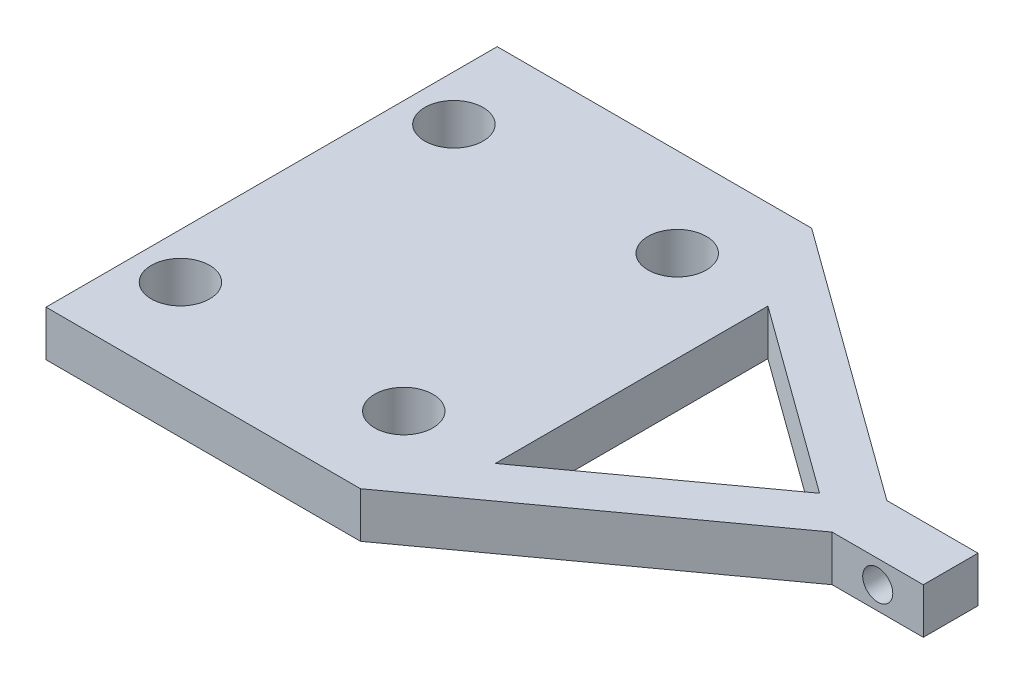
ISO-10303-21;
HEADER;
FILE_DESCRIPTION(('STEP AP214'),'2;1');
FILE_NAME('part.step','',(''),(''),'','','');
FILE_SCHEMA(('AUTOMOTIVE_DESIGN { 1 0 10303 214 1 1 1 1 }'));
ENDSEC;
DATA;
#1=APPLICATION_CONTEXT('core data for automotive mechanical design processes');
#2=APPLICATION_PROTOCOL_DEFINITION('international standard','automotive_design',2000,#1);
#3=PRODUCT_CONTEXT('',#1,'mechanical');
#4=PRODUCT('Part','Part','',(#3));
#5=PRODUCT_RELATED_PRODUCT_CATEGORY('part','',(#4));
#6=PRODUCT_DEFINITION_FORMATION('','',#4);
#7=PRODUCT_DEFINITION_CONTEXT('part definition',#1,'design');
#8=PRODUCT_DEFINITION('design','',#6,#7);
#9=PRODUCT_DEFINITION_SHAPE('','',#8);
#10=(LENGTH_UNIT() NAMED_UNIT(*) SI_UNIT(.MILLI.,.METRE.));
#11=(NAMED_UNIT(*) PLANE_ANGLE_UNIT() SI_UNIT($,.RADIAN.));
#12=(NAMED_UNIT(*) SI_UNIT($,.STERADIAN.) SOLID_ANGLE_UNIT());
#13=UNCERTAINTY_MEASURE_WITH_UNIT(LENGTH_MEASURE(1.E-05),#10,'distance_accuracy_value','');
#14=(GEOMETRIC_REPRESENTATION_CONTEXT(3) GLOBAL_UNCERTAINTY_ASSIGNED_CONTEXT((#13)) GLOBAL_UNIT_ASSIGNED_CONTEXT((#10,
#11,#12)) REPRESENTATION_CONTEXT('',''));
#15=CARTESIAN_POINT('',(0.,0.,0.));
#16=DIRECTION('',(0.,0.,1.));
#17=DIRECTION('',(1.,0.,0.));
#18=AXIS2_PLACEMENT_3D('',#15,#16,#17);
#19=CARTESIAN_POINT('',(0.,5.,0.));
#20=DIRECTION('',(1.,0.,0.));
#21=DIRECTION('',(0.,0.,-1.));
#22=AXIS2_PLACEMENT_3D('',#19,#20,#21);
#23=PLANE('',#22);
#24=DIRECTION('',(0.,0.,1.));
#25=VECTOR('',#24,1.);
#26=CARTESIAN_POINT('',(0.,0.,0.));
#27=LINE('',#26,#25);
#28=CARTESIAN_POINT('',(0.,0.,-49.5));
#29=VERTEX_POINT('',#28);
#30=CARTESIAN_POINT('',(0.,0.,0.));
#31=VERTEX_POINT('',#30);
#32=EDGE_CURVE('E355',#29,#31,#27,.T.);
#33=ORIENTED_EDGE('',*,*,#32,.T.);
#34=DIRECTION('',(0.,-1.,0.));
#35=VECTOR('',#34,1.);
#36=CARTESIAN_POINT('',(0.,5.,0.));
#37=LINE('',#36,#35);
#38=CARTESIAN_POINT('',(0.,5.,0.));
#39=VERTEX_POINT('',#38);
#40=EDGE_CURVE('E13',#39,#31,#37,.T.);
#41=ORIENTED_EDGE('',*,*,#40,.F.);
#42=DIRECTION('',(0.,0.,1.));
#43=VECTOR('',#42,1.);
#44=CARTESIAN_POINT('',(0.,5.,0.));
#45=LINE('',#44,#43);
#46=CARTESIAN_POINT('',(0.,5.,-49.5));
#47=VERTEX_POINT('',#46);
#48=EDGE_CURVE('E249',#47,#39,#45,.T.);
#49=ORIENTED_EDGE('',*,*,#48,.F.);
#50=DIRECTION('',(0.,-1.,0.));
#51=VECTOR('',#50,1.);
#52=CARTESIAN_POINT('',(0.,5.,-49.5));
#53=LINE('',#52,#51);
#54=EDGE_CURVE('E343',#47,#29,#53,.T.);
#55=ORIENTED_EDGE('',*,*,#54,.T.);
#56=EDGE_LOOP('',(#33,#41,#49,#55));
#57=FACE_BOUND('',#56,.T.);
#58=ADVANCED_FACE('F73',(#57),#23,.F.);
#59=CARTESIAN_POINT('',(0.,5.,0.));
#60=DIRECTION('',(0.,0.,-1.));
#61=DIRECTION('',(-1.,0.,0.));
#62=AXIS2_PLACEMENT_3D('',#59,#60,#61);
#63=PLANE('',#62);
#64=DIRECTION('',(1.,0.,0.));
#65=VECTOR('',#64,1.);
#66=CARTESIAN_POINT('',(0.,0.,0.));
#67=LINE('',#66,#65);
#68=CARTESIAN_POINT('',(34.5,0.,0.));
#69=VERTEX_POINT('',#68);
#70=EDGE_CURVE('E102',#31,#69,#67,.T.);
#71=ORIENTED_EDGE('',*,*,#70,.T.);
#72=DIRECTION('',(0.,-1.,0.));
#73=VECTOR('',#72,1.);
#74=CARTESIAN_POINT('',(34.5,5.,0.));
#75=LINE('',#74,#73);
#76=CARTESIAN_POINT('',(34.5,5.,0.));
#77=VERTEX_POINT('',#76);
#78=EDGE_CURVE('E82',#77,#69,#75,.T.);
#79=ORIENTED_EDGE('',*,*,#78,.F.);
#80=DIRECTION('',(1.,0.,0.));
#81=VECTOR('',#80,1.);
#82=CARTESIAN_POINT('',(0.,5.,0.));
#83=LINE('',#82,#81);
#84=EDGE_CURVE('E253',#39,#77,#83,.T.);
#85=ORIENTED_EDGE('',*,*,#84,.F.);
#86=ORIENTED_EDGE('',*,*,#40,.T.);
#87=EDGE_LOOP('',(#71,#79,#85,#86));
#88=FACE_BOUND('',#87,.T.);
#89=ADVANCED_FACE('F365',(#88),#63,.F.);
#90=CARTESIAN_POINT('',(0.,5.,-49.5));
#91=DIRECTION('',(0.,0.,1.));
#92=DIRECTION('',(1.,0.,0.));
#93=AXIS2_PLACEMENT_3D('',#90,#91,#92);
#94=PLANE('',#93);
#95=DIRECTION('',(-1.,0.,0.));
#96=VECTOR('',#95,1.);
#97=CARTESIAN_POINT('',(0.,0.,-49.5));
#98=LINE('',#97,#96);
#99=CARTESIAN_POINT('',(34.5,0.,-49.5));
#100=VERTEX_POINT('',#99);
#101=EDGE_CURVE('E107',#100,#29,#98,.T.);
#102=ORIENTED_EDGE('',*,*,#101,.T.);
#103=ORIENTED_EDGE('',*,*,#54,.F.);
#104=DIRECTION('',(-1.,0.,0.));
#105=VECTOR('',#104,1.);
#106=CARTESIAN_POINT('',(0.,5.,-49.5));
#107=LINE('',#106,#105);
#108=CARTESIAN_POINT('',(34.5,5.,-49.5));
#109=VERTEX_POINT('',#108);
#110=EDGE_CURVE('E90',#109,#47,#107,.T.);
#111=ORIENTED_EDGE('',*,*,#110,.F.);
#112=DIRECTION('',(0.,-1.,0.));
#113=VECTOR('',#112,1.);
#114=CARTESIAN_POINT('',(34.5,5.,-49.5));
#115=LINE('',#114,#113);
#116=EDGE_CURVE('E340',#109,#100,#115,.T.);
#117=ORIENTED_EDGE('',*,*,#116,.T.);
#118=EDGE_LOOP('',(#102,#103,#111,#117));
#119=FACE_BOUND('',#118,.T.);
#120=ADVANCED_FACE('F283',(#119),#94,.F.);
#121=CARTESIAN_POINT('',(0.,5.,0.));
#122=DIRECTION('',(0.,-1.,0.));
#123=DIRECTION('',(0.,0.,-1.));
#124=AXIS2_PLACEMENT_3D('',#121,#122,#123);
#125=PLANE('',#124);
#126=ORIENTED_EDGE('',*,*,#84,.T.);
#127=DIRECTION('',(0.809610443394388,0.,-0.586967571460931));
#128=VECTOR('',#127,1.);
#129=CARTESIAN_POINT('',(34.5,5.,0.));
#130=LINE('',#129,#128);
#131=CARTESIAN_POINT('',(64.5,5.,-21.75));
#132=VERTEX_POINT('',#131);
#133=EDGE_CURVE('E203',#77,#132,#130,.T.);
#134=ORIENTED_EDGE('',*,*,#133,.T.);
#135=DIRECTION('',(-1.,0.,0.));
#136=VECTOR('',#135,1.);
#137=CARTESIAN_POINT('',(74.5,5.,-21.75));
#138=LINE('',#137,#136);
#139=CARTESIAN_POINT('',(74.5,5.,-21.75));
#140=VERTEX_POINT('',#139);
#141=EDGE_CURVE('E210',#140,#132,#138,.T.);
#142=ORIENTED_EDGE('',*,*,#141,.F.);
#143=DIRECTION('',(0.,0.,1.));
#144=VECTOR('',#143,1.);
#145=CARTESIAN_POINT('',(74.5,5.,-27.75));
#146=LINE('',#145,#144);
#147=CARTESIAN_POINT('',(74.5,5.,-27.75));
#148=VERTEX_POINT('',#147);
#149=EDGE_CURVE('E215',#148,#140,#146,.T.);
#150=ORIENTED_EDGE('',*,*,#149,.F.);
#151=DIRECTION('',(-1.,0.,0.));
#152=VECTOR('',#151,1.);
#153=CARTESIAN_POINT('',(74.5,5.,-27.75));
#154=LINE('',#153,#152);
#155=CARTESIAN_POINT('',(64.5,5.,-27.75));
#156=VERTEX_POINT('',#155);
#157=EDGE_CURVE('E300',#148,#156,#154,.T.);
#158=ORIENTED_EDGE('',*,*,#157,.T.);
#159=DIRECTION('',(-0.809610443394388,0.,-0.586967571460931));
#160=VECTOR('',#159,1.);
#161=CARTESIAN_POINT('',(64.5,5.,-27.75));
#162=LINE('',#161,#160);
#163=EDGE_CURVE('E308',#156,#109,#162,.T.);
#164=ORIENTED_EDGE('',*,*,#163,.T.);
#165=ORIENTED_EDGE('',*,*,#110,.T.);
#166=ORIENTED_EDGE('',*,*,#48,.T.);
#167=EDGE_LOOP('',(#126,#134,#142,#150,#158,#164,#165,#166));
#168=FACE_BOUND('',#167,.T.);
#169=CARTESIAN_POINT('',(29.5,5.,-39.75));
#170=DIRECTION('',(0.,1.,0.));
#171=DIRECTION('',(0.,0.,-1.));
#172=AXIS2_PLACEMENT_3D('',#169,#170,#171);
#173=CIRCLE('',#172,3.2);
#174=CARTESIAN_POINT('',(29.5,5.,-42.95));
#175=VERTEX_POINT('',#174);
#176=EDGE_CURVE('E260',#175,#175,#173,.T.);
#177=ORIENTED_EDGE('',*,*,#176,.F.);
#178=EDGE_LOOP('',(#177));
#179=FACE_BOUND('',#178,.T.);
#180=CARTESIAN_POINT('',(29.5,5.,-9.75));
#181=DIRECTION('',(0.,1.,0.));
#182=DIRECTION('',(0.,0.,1.));
#183=AXIS2_PLACEMENT_3D('',#180,#181,#182);
#184=CIRCLE('',#183,3.2);
#185=CARTESIAN_POINT('',(29.5,5.,-6.55));
#186=VERTEX_POINT('',#185);
#187=EDGE_CURVE('E288',#186,#186,#184,.T.);
#188=ORIENTED_EDGE('',*,*,#187,.F.);
#189=EDGE_LOOP('',(#188));
#190=FACE_BOUND('',#189,.T.);
#191=CARTESIAN_POINT('',(5.,5.,-9.75));
#192=DIRECTION('',(0.,1.,0.));
#193=DIRECTION('',(0.,0.,-1.));
#194=AXIS2_PLACEMENT_3D('',#191,#192,#193);
#195=CIRCLE('',#194,3.2);
#196=CARTESIAN_POINT('',(5.,5.,-12.95));
#197=VERTEX_POINT('',#196);
#198=EDGE_CURVE('E228',#197,#197,#195,.T.);
#199=ORIENTED_EDGE('',*,*,#198,.F.);
#200=EDGE_LOOP('',(#199));
#201=FACE_BOUND('',#200,.T.);
#202=CARTESIAN_POINT('',(5.,5.,-39.75));
#203=DIRECTION('',(0.,1.,0.));
#204=DIRECTION('',(0.,0.,1.));
#205=AXIS2_PLACEMENT_3D('',#202,#203,#204);
#206=CIRCLE('',#205,3.2);
#207=CARTESIAN_POINT('',(5.,5.,-36.55));
#208=VERTEX_POINT('',#207);
#209=EDGE_CURVE('E233',#208,#208,#206,.T.);
#210=ORIENTED_EDGE('',*,*,#209,.F.);
#211=EDGE_LOOP('',(#210));
#212=FACE_BOUND('',#211,.T.);
#213=DIRECTION('',(0.809610443394387,0.,-0.586967571460931));
#214=VECTOR('',#213,1.);
#215=CARTESIAN_POINT('',(39.5,5.,-9.8008096635178));
#216=LINE('',#215,#214);
#217=CARTESIAN_POINT('',(39.5,5.,-9.8008096635178));
#218=VERTEX_POINT('',#217);
#219=CARTESIAN_POINT('',(60.1195728779065,5.,-24.75));
#220=VERTEX_POINT('',#219);
#221=EDGE_CURVE('E165',#218,#220,#216,.T.);
#222=ORIENTED_EDGE('',*,*,#221,.F.);
#223=DIRECTION('',(0.,0.,1.));
#224=VECTOR('',#223,1.);
#225=CARTESIAN_POINT('',(39.5,5.,-39.6991903364822));
#226=LINE('',#225,#224);
#227=CARTESIAN_POINT('',(39.5,5.,-39.6991903364822));
#228=VERTEX_POINT('',#227);
#229=EDGE_CURVE('E171',#228,#218,#226,.T.);
#230=ORIENTED_EDGE('',*,*,#229,.F.);
#231=DIRECTION('',(-0.809610443394388,0.,-0.586967571460931));
#232=VECTOR('',#231,1.);
#233=CARTESIAN_POINT('',(60.1195728779065,5.,-24.75));
#234=LINE('',#233,#232);
#235=EDGE_CURVE('E170',#220,#228,#234,.T.);
#236=ORIENTED_EDGE('',*,*,#235,.F.);
#237=EDGE_LOOP('',(#222,#230,#236));
#238=FACE_BOUND('',#237,.T.);
#239=ADVANCED_FACE('F280',(#168,#179,#190,#201,#212,#238),#125,.F.);
#240=CARTESIAN_POINT('',(0.,0.,0.));
#241=DIRECTION('',(0.,-1.,0.));
#242=DIRECTION('',(0.,0.,-1.));
#243=AXIS2_PLACEMENT_3D('',#240,#241,#242);
#244=PLANE('',#243);
#245=ORIENTED_EDGE('',*,*,#101,.F.);
#246=DIRECTION('',(-0.809610443394388,0.,-0.586967571460931));
#247=VECTOR('',#246,1.);
#248=CARTESIAN_POINT('',(64.5,0.,-27.75));
#249=LINE('',#248,#247);
#250=CARTESIAN_POINT('',(64.5,0.,-27.75));
#251=VERTEX_POINT('',#250);
#252=EDGE_CURVE('E191',#251,#100,#249,.T.);
#253=ORIENTED_EDGE('',*,*,#252,.F.);
#254=DIRECTION('',(-1.,0.,0.));
#255=VECTOR('',#254,1.);
#256=CARTESIAN_POINT('',(74.5,0.,-27.75));
#257=LINE('',#256,#255);
#258=CARTESIAN_POINT('',(74.5,0.,-27.75));
#259=VERTEX_POINT('',#258);
#260=EDGE_CURVE('E194',#259,#251,#257,.T.);
#261=ORIENTED_EDGE('',*,*,#260,.F.);
#262=DIRECTION('',(0.,0.,1.));
#263=VECTOR('',#262,1.);
#264=CARTESIAN_POINT('',(74.5,0.,-27.75));
#265=LINE('',#264,#263);
#266=CARTESIAN_POINT('',(74.5,0.,-21.75));
#267=VERTEX_POINT('',#266);
#268=EDGE_CURVE('E200',#259,#267,#265,.T.);
#269=ORIENTED_EDGE('',*,*,#268,.T.);
#270=DIRECTION('',(-1.,0.,0.));
#271=VECTOR('',#270,1.);
#272=CARTESIAN_POINT('',(74.5,0.,-21.75));
#273=LINE('',#272,#271);
#274=CARTESIAN_POINT('',(64.5,0.,-21.75));
#275=VERTEX_POINT('',#274);
#276=EDGE_CURVE('E188',#267,#275,#273,.T.);
#277=ORIENTED_EDGE('',*,*,#276,.T.);
#278=DIRECTION('',(0.809610443394388,0.,-0.586967571460931));
#279=VECTOR('',#278,1.);
#280=CARTESIAN_POINT('',(34.5,0.,0.));
#281=LINE('',#280,#279);
#282=EDGE_CURVE('E206',#69,#275,#281,.T.);
#283=ORIENTED_EDGE('',*,*,#282,.F.);
#284=ORIENTED_EDGE('',*,*,#70,.F.);
#285=ORIENTED_EDGE('',*,*,#32,.F.);
#286=EDGE_LOOP('',(#245,#253,#261,#269,#277,#283,#284,#285));
#287=FACE_BOUND('',#286,.T.);
#288=CARTESIAN_POINT('',(29.5,0.,-39.75));
#289=DIRECTION('',(0.,1.,0.));
#290=DIRECTION('',(0.,0.,-1.));
#291=AXIS2_PLACEMENT_3D('',#288,#289,#290);
#292=CIRCLE('',#291,3.2);
#293=CARTESIAN_POINT('',(29.5,0.,-42.95));
#294=VERTEX_POINT('',#293);
#295=EDGE_CURVE('E181',#294,#294,#292,.T.);
#296=ORIENTED_EDGE('',*,*,#295,.T.);
#297=EDGE_LOOP('',(#296));
#298=FACE_BOUND('',#297,.T.);
#299=CARTESIAN_POINT('',(29.5,0.,-9.75));
#300=DIRECTION('',(0.,1.,0.));
#301=DIRECTION('',(0.,0.,1.));
#302=AXIS2_PLACEMENT_3D('',#299,#300,#301);
#303=CIRCLE('',#302,3.2);
#304=CARTESIAN_POINT('',(29.5,0.,-6.55));
#305=VERTEX_POINT('',#304);
#306=EDGE_CURVE('E265',#305,#305,#303,.T.);
#307=ORIENTED_EDGE('',*,*,#306,.T.);
#308=EDGE_LOOP('',(#307));
#309=FACE_BOUND('',#308,.T.);
#310=CARTESIAN_POINT('',(5.,0.,-9.75));
#311=DIRECTION('',(0.,1.,0.));
#312=DIRECTION('',(0.,0.,-1.));
#313=AXIS2_PLACEMENT_3D('',#310,#311,#312);
#314=CIRCLE('',#313,3.2);
#315=CARTESIAN_POINT('',(5.,0.,-12.95));
#316=VERTEX_POINT('',#315);
#317=EDGE_CURVE('E234',#316,#316,#314,.T.);
#318=ORIENTED_EDGE('',*,*,#317,.T.);
#319=EDGE_LOOP('',(#318));
#320=FACE_BOUND('',#319,.T.);
#321=CARTESIAN_POINT('',(5.,0.,-39.75));
#322=DIRECTION('',(0.,1.,0.));
#323=DIRECTION('',(0.,0.,1.));
#324=AXIS2_PLACEMENT_3D('',#321,#322,#323);
#325=CIRCLE('',#324,3.2);
#326=CARTESIAN_POINT('',(5.,0.,-36.55));
#327=VERTEX_POINT('',#326);
#328=EDGE_CURVE('E247',#327,#327,#325,.T.);
#329=ORIENTED_EDGE('',*,*,#328,.T.);
#330=EDGE_LOOP('',(#329));
#331=FACE_BOUND('',#330,.T.);
#332=DIRECTION('',(0.,0.,1.));
#333=VECTOR('',#332,1.);
#334=CARTESIAN_POINT('',(39.5,0.,-39.6991903364822));
#335=LINE('',#334,#333);
#336=CARTESIAN_POINT('',(39.5,0.,-39.6991903364822));
#337=VERTEX_POINT('',#336);
#338=CARTESIAN_POINT('',(39.5,0.,-9.8008096635178));
#339=VERTEX_POINT('',#338);
#340=EDGE_CURVE('E184',#337,#339,#335,.T.);
#341=ORIENTED_EDGE('',*,*,#340,.T.);
#342=DIRECTION('',(0.809610443394388,0.,-0.586967571460931));
#343=VECTOR('',#342,1.);
#344=CARTESIAN_POINT('',(39.5,0.,-9.8008096635178));
#345=LINE('',#344,#343);
#346=CARTESIAN_POINT('',(60.1195728779065,0.,-24.75));
#347=VERTEX_POINT('',#346);
#348=EDGE_CURVE('E162',#339,#347,#345,.T.);
#349=ORIENTED_EDGE('',*,*,#348,.T.);
#350=DIRECTION('',(-0.809610443394388,0.,-0.586967571460931));
#351=VECTOR('',#350,1.);
#352=CARTESIAN_POINT('',(60.1195728779065,0.,-24.75));
#353=LINE('',#352,#351);
#354=EDGE_CURVE('E174',#347,#337,#353,.T.);
#355=ORIENTED_EDGE('',*,*,#354,.T.);
#356=EDGE_LOOP('',(#341,#349,#355));
#357=FACE_BOUND('',#356,.T.);
#358=ADVANCED_FACE('F183',(#287,#298,#309,#320,#331,#357),#244,.T.);
#359=CARTESIAN_POINT('',(5.,0.,-39.75));
#360=DIRECTION('',(0.,1.,0.));
#361=DIRECTION('',(0.,0.,1.));
#362=AXIS2_PLACEMENT_3D('',#359,#360,#361);
#363=CYLINDRICAL_SURFACE('',#362,3.2);
#364=ORIENTED_EDGE('',*,*,#328,.F.);
#365=EDGE_LOOP('',(#364));
#366=FACE_BOUND('',#365,.T.);
#367=ORIENTED_EDGE('',*,*,#209,.T.);
#368=EDGE_LOOP('',(#367));
#369=FACE_BOUND('',#368,.T.);
#370=ADVANCED_FACE('F407',(#366,#369),#363,.F.);
#371=CARTESIAN_POINT('',(5.,0.,-9.75));
#372=DIRECTION('',(0.,1.,0.));
#373=DIRECTION('',(0.,0.,1.));
#374=AXIS2_PLACEMENT_3D('',#371,#372,#373);
#375=CYLINDRICAL_SURFACE('',#374,3.2);
#376=ORIENTED_EDGE('',*,*,#317,.F.);
#377=EDGE_LOOP('',(#376));
#378=FACE_BOUND('',#377,.T.);
#379=ORIENTED_EDGE('',*,*,#198,.T.);
#380=EDGE_LOOP('',(#379));
#381=FACE_BOUND('',#380,.T.);
#382=ADVANCED_FACE('F410',(#378,#381),#375,.F.);
#383=CARTESIAN_POINT('',(29.5,0.,-9.75));
#384=DIRECTION('',(0.,1.,0.));
#385=DIRECTION('',(0.,0.,1.));
#386=AXIS2_PLACEMENT_3D('',#383,#384,#385);
#387=CYLINDRICAL_SURFACE('',#386,3.2);
#388=ORIENTED_EDGE('',*,*,#306,.F.);
#389=EDGE_LOOP('',(#388));
#390=FACE_BOUND('',#389,.T.);
#391=ORIENTED_EDGE('',*,*,#187,.T.);
#392=EDGE_LOOP('',(#391));
#393=FACE_BOUND('',#392,.T.);
#394=ADVANCED_FACE('F276',(#390,#393),#387,.F.);
#395=CARTESIAN_POINT('',(29.5,0.,-39.75));
#396=DIRECTION('',(0.,1.,0.));
#397=DIRECTION('',(0.,0.,1.));
#398=AXIS2_PLACEMENT_3D('',#395,#396,#397);
#399=CYLINDRICAL_SURFACE('',#398,3.2);
#400=ORIENTED_EDGE('',*,*,#295,.F.);
#401=EDGE_LOOP('',(#400));
#402=FACE_BOUND('',#401,.T.);
#403=ORIENTED_EDGE('',*,*,#176,.T.);
#404=EDGE_LOOP('',(#403));
#405=FACE_BOUND('',#404,.T.);
#406=ADVANCED_FACE('F272',(#402,#405),#399,.F.);
#407=CARTESIAN_POINT('',(74.5,-63.641574461982,-27.75));
#408=DIRECTION('',(0.,0.,-1.));
#409=DIRECTION('',(-1.,0.,0.));
#410=AXIS2_PLACEMENT_3D('',#407,#408,#409);
#411=PLANE('',#410);
#412=CARTESIAN_POINT('',(69.5,2.5,-27.75));
#413=DIRECTION('',(0.,0.,-1.));
#414=DIRECTION('',(-1.,0.,0.));
#415=AXIS2_PLACEMENT_3D('',#412,#413,#414);
#416=CIRCLE('',#415,1.65);
#417=CARTESIAN_POINT('',(67.85,2.5,-27.75));
#418=VERTEX_POINT('',#417);
#419=EDGE_CURVE('E199',#418,#418,#416,.T.);
#420=ORIENTED_EDGE('',*,*,#419,.F.);
#421=EDGE_LOOP('',(#420));
#422=FACE_BOUND('',#421,.T.);
#423=DIRECTION('',(0.,1.,0.));
#424=VECTOR('',#423,1.);
#425=CARTESIAN_POINT('',(74.5,-63.641574461982,-27.75));
#426=LINE('',#425,#424);
#427=EDGE_CURVE('E212',#259,#148,#426,.T.);
#428=ORIENTED_EDGE('',*,*,#427,.F.);
#429=ORIENTED_EDGE('',*,*,#260,.T.);
#430=DIRECTION('',(0.,1.,0.));
#431=VECTOR('',#430,1.);
#432=CARTESIAN_POINT('',(64.5,-63.641574461982,-27.75));
#433=LINE('',#432,#431);
#434=EDGE_CURVE('E198',#251,#156,#433,.T.);
#435=ORIENTED_EDGE('',*,*,#434,.T.);
#436=ORIENTED_EDGE('',*,*,#157,.F.);
#437=EDGE_LOOP('',(#428,#429,#435,#436));
#438=FACE_BOUND('',#437,.T.);
#439=ADVANCED_FACE('F275',(#422,#438),#411,.T.);
#440=CARTESIAN_POINT('',(74.5,-63.641574461982,-27.75));
#441=DIRECTION('',(-1.,0.,0.));
#442=DIRECTION('',(0.,0.,1.));
#443=AXIS2_PLACEMENT_3D('',#440,#441,#442);
#444=PLANE('',#443);
#445=ORIENTED_EDGE('',*,*,#268,.F.);
#446=ORIENTED_EDGE('',*,*,#427,.T.);
#447=ORIENTED_EDGE('',*,*,#149,.T.);
#448=DIRECTION('',(0.,1.,0.));
#449=VECTOR('',#448,1.);
#450=CARTESIAN_POINT('',(74.5,-63.641574461982,-21.75));
#451=LINE('',#450,#449);
#452=EDGE_CURVE('E216',#267,#140,#451,.T.);
#453=ORIENTED_EDGE('',*,*,#452,.F.);
#454=EDGE_LOOP('',(#445,#446,#447,#453));
#455=FACE_BOUND('',#454,.T.);
#456=ADVANCED_FACE('F388',(#455),#444,.F.);
#457=CARTESIAN_POINT('',(74.5,-63.641574461982,-21.75));
#458=DIRECTION('',(0.,0.,-1.));
#459=DIRECTION('',(-1.,0.,0.));
#460=AXIS2_PLACEMENT_3D('',#457,#458,#459);
#461=PLANE('',#460);
#462=CARTESIAN_POINT('',(69.5,2.5,-21.75));
#463=DIRECTION('',(0.,0.,1.));
#464=DIRECTION('',(1.,0.,0.));
#465=AXIS2_PLACEMENT_3D('',#462,#463,#464);
#466=CIRCLE('',#465,1.65);
#467=CARTESIAN_POINT('',(71.15,2.5,-21.75));
#468=VERTEX_POINT('',#467);
#469=EDGE_CURVE('E381',#468,#468,#466,.T.);
#470=ORIENTED_EDGE('',*,*,#469,.F.);
#471=EDGE_LOOP('',(#470));
#472=FACE_BOUND('',#471,.T.);
#473=ORIENTED_EDGE('',*,*,#276,.F.);
#474=ORIENTED_EDGE('',*,*,#452,.T.);
#475=ORIENTED_EDGE('',*,*,#141,.T.);
#476=DIRECTION('',(0.,1.,0.));
#477=VECTOR('',#476,1.);
#478=CARTESIAN_POINT('',(64.5,-63.641574461982,-21.75));
#479=LINE('',#478,#477);
#480=EDGE_CURVE('E209',#275,#132,#479,.T.);
#481=ORIENTED_EDGE('',*,*,#480,.F.);
#482=EDGE_LOOP('',(#473,#474,#475,#481));
#483=FACE_BOUND('',#482,.T.);
#484=ADVANCED_FACE('F371',(#472,#483),#461,.F.);
#485=CARTESIAN_POINT('',(34.5,-63.641574461982,0.));
#486=DIRECTION('',(0.586967571460931,0.,0.809610443394388));
#487=DIRECTION('',(0.809610443394388,0.,-0.586967571460931));
#488=AXIS2_PLACEMENT_3D('',#485,#486,#487);
#489=PLANE('',#488);
#490=ORIENTED_EDGE('',*,*,#78,.T.);
#491=ORIENTED_EDGE('',*,*,#282,.T.);
#492=ORIENTED_EDGE('',*,*,#480,.T.);
#493=ORIENTED_EDGE('',*,*,#133,.F.);
#494=EDGE_LOOP('',(#490,#491,#492,#493));
#495=FACE_BOUND('',#494,.T.);
#496=ADVANCED_FACE('F367',(#495),#489,.T.);
#497=CARTESIAN_POINT('',(64.5,-63.641574461982,-27.75));
#498=DIRECTION('',(0.586967571460931,0.,-0.809610443394388));
#499=DIRECTION('',(-0.809610443394388,0.,-0.586967571460931));
#500=AXIS2_PLACEMENT_3D('',#497,#498,#499);
#501=PLANE('',#500);
#502=ORIENTED_EDGE('',*,*,#434,.F.);
#503=ORIENTED_EDGE('',*,*,#252,.T.);
#504=ORIENTED_EDGE('',*,*,#116,.F.);
#505=ORIENTED_EDGE('',*,*,#163,.F.);
#506=EDGE_LOOP('',(#502,#503,#504,#505));
#507=FACE_BOUND('',#506,.T.);
#508=ADVANCED_FACE('F338',(#507),#501,.T.);
#509=CARTESIAN_POINT('',(39.5,-63.641574461982,-9.8008096635178));
#510=DIRECTION('',(0.586967571460931,0.,0.809610443394387));
#511=DIRECTION('',(0.809610443394388,0.,-0.586967571460931));
#512=AXIS2_PLACEMENT_3D('',#509,#510,#511);
#513=PLANE('',#512);
#514=ORIENTED_EDGE('',*,*,#348,.F.);
#515=DIRECTION('',(0.,1.,0.));
#516=VECTOR('',#515,1.);
#517=CARTESIAN_POINT('',(39.5,-63.641574461982,-9.8008096635178));
#518=LINE('',#517,#516);
#519=EDGE_CURVE('E223',#339,#218,#518,.T.);
#520=ORIENTED_EDGE('',*,*,#519,.T.);
#521=ORIENTED_EDGE('',*,*,#221,.T.);
#522=DIRECTION('',(0.,1.,0.));
#523=VECTOR('',#522,1.);
#524=CARTESIAN_POINT('',(60.1195728779065,-63.641574461982,-24.75));
#525=LINE('',#524,#523);
#526=EDGE_CURVE('E158',#347,#220,#525,.T.);
#527=ORIENTED_EDGE('',*,*,#526,.F.);
#528=EDGE_LOOP('',(#514,#520,#521,#527));
#529=FACE_BOUND('',#528,.T.);
#530=ADVANCED_FACE('F160',(#529),#513,.F.);
#531=CARTESIAN_POINT('',(39.5,-63.641574461982,-39.6991903364822));
#532=DIRECTION('',(-1.,0.,0.));
#533=DIRECTION('',(0.,0.,1.));
#534=AXIS2_PLACEMENT_3D('',#531,#532,#533);
#535=PLANE('',#534);
#536=ORIENTED_EDGE('',*,*,#340,.F.);
#537=DIRECTION('',(0.,1.,0.));
#538=VECTOR('',#537,1.);
#539=CARTESIAN_POINT('',(39.5,-63.641574461982,-39.6991903364822));
#540=LINE('',#539,#538);
#541=EDGE_CURVE('E176',#337,#228,#540,.T.);
#542=ORIENTED_EDGE('',*,*,#541,.T.);
#543=ORIENTED_EDGE('',*,*,#229,.T.);
#544=ORIENTED_EDGE('',*,*,#519,.F.);
#545=EDGE_LOOP('',(#536,#542,#543,#544));
#546=FACE_BOUND('',#545,.T.);
#547=ADVANCED_FACE('F421',(#546),#535,.F.);
#548=CARTESIAN_POINT('',(60.1195728779065,-63.641574461982,-24.75));
#549=DIRECTION('',(0.586967571460931,0.,-0.809610443394387));
#550=DIRECTION('',(-0.809610443394388,0.,-0.586967571460931));
#551=AXIS2_PLACEMENT_3D('',#548,#549,#550);
#552=PLANE('',#551);
#553=ORIENTED_EDGE('',*,*,#354,.F.);
#554=ORIENTED_EDGE('',*,*,#526,.T.);
#555=ORIENTED_EDGE('',*,*,#235,.T.);
#556=ORIENTED_EDGE('',*,*,#541,.F.);
#557=EDGE_LOOP('',(#553,#554,#555,#556));
#558=FACE_BOUND('',#557,.T.);
#559=ADVANCED_FACE('F175',(#558),#552,.F.);
#560=CARTESIAN_POINT('',(69.5,2.5,-31.75));
#561=DIRECTION('',(0.,0.,1.));
#562=DIRECTION('',(1.,0.,0.));
#563=AXIS2_PLACEMENT_3D('',#560,#561,#562);
#564=CYLINDRICAL_SURFACE('',#563,1.65);
#565=ORIENTED_EDGE('',*,*,#419,.T.);
#566=EDGE_LOOP('',(#565));
#567=FACE_BOUND('',#566,.T.);
#568=ORIENTED_EDGE('',*,*,#469,.T.);
#569=EDGE_LOOP('',(#568));
#570=FACE_BOUND('',#569,.T.);
#571=ADVANCED_FACE('F385',(#567,#570),#564,.F.);
#572=CLOSED_SHELL('',(#58,#89,#120,#239,#358,#370,#382,#394,#406,#439,#456,#484,#496,#508,#530,
#547,#559,#571));
#573=MANIFOLD_SOLID_BREP('B2',#572);
#574=ADVANCED_BREP_SHAPE_REPRESENTATION('',(#18,#573),#14);
#575=SHAPE_DEFINITION_REPRESENTATION(#9,#574);
ENDSEC;
END-ISO-10303-21;
